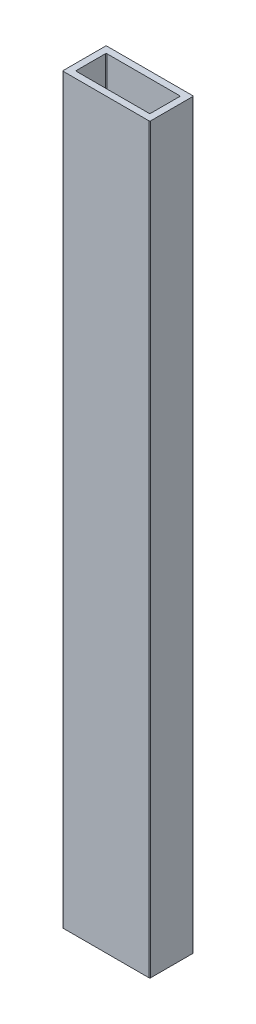
ISO-10303-21;
HEADER;
FILE_DESCRIPTION(('STEP AP214'),'2;1');
FILE_NAME('part.step','',(''),(''),'','','');
FILE_SCHEMA(('AUTOMOTIVE_DESIGN { 1 0 10303 214 1 1 1 1 }'));
ENDSEC;
DATA;
#1=APPLICATION_CONTEXT('core data for automotive mechanical design processes');
#2=APPLICATION_PROTOCOL_DEFINITION('international standard','automotive_design',2000,#1);
#3=PRODUCT_CONTEXT('',#1,'mechanical');
#4=PRODUCT('Part','Part','',(#3));
#5=PRODUCT_RELATED_PRODUCT_CATEGORY('part','',(#4));
#6=PRODUCT_DEFINITION_FORMATION('','',#4);
#7=PRODUCT_DEFINITION_CONTEXT('part definition',#1,'design');
#8=PRODUCT_DEFINITION('design','',#6,#7);
#9=PRODUCT_DEFINITION_SHAPE('','',#8);
#10=(LENGTH_UNIT() NAMED_UNIT(*) SI_UNIT(.MILLI.,.METRE.));
#11=(NAMED_UNIT(*) PLANE_ANGLE_UNIT() SI_UNIT($,.RADIAN.));
#12=(NAMED_UNIT(*) SI_UNIT($,.STERADIAN.) SOLID_ANGLE_UNIT());
#13=UNCERTAINTY_MEASURE_WITH_UNIT(LENGTH_MEASURE(1.E-05),#10,'distance_accuracy_value','');
#14=(GEOMETRIC_REPRESENTATION_CONTEXT(3) GLOBAL_UNCERTAINTY_ASSIGNED_CONTEXT((#13)) GLOBAL_UNIT_ASSIGNED_CONTEXT((#10,
#11,#12)) REPRESENTATION_CONTEXT('',''));
#15=CARTESIAN_POINT('',(0.,0.,0.));
#16=DIRECTION('',(0.,0.,1.));
#17=DIRECTION('',(1.,0.,0.));
#18=AXIS2_PLACEMENT_3D('',#15,#16,#17);
#19=CARTESIAN_POINT('',(0.,170.,0.));
#20=DIRECTION('',(0.,-1.,0.));
#21=DIRECTION('',(0.,0.,-1.));
#22=AXIS2_PLACEMENT_3D('',#19,#20,#21);
#23=PLANE('',#22);
#24=DIRECTION('',(0.,0.,-1.));
#25=VECTOR('',#24,1.);
#26=CARTESIAN_POINT('',(10.,170.,-5.));
#27=LINE('',#26,#25);
#28=CARTESIAN_POINT('',(10.,170.,4.8));
#29=VERTEX_POINT('',#28);
#30=CARTESIAN_POINT('',(10.,170.,-4.8));
#31=VERTEX_POINT('',#30);
#32=EDGE_CURVE('E278',#29,#31,#27,.T.);
#33=ORIENTED_EDGE('',*,*,#32,.T.);
#34=CARTESIAN_POINT('',(9.8,170.,-4.8));
#35=DIRECTION('',(0.,-1.,0.));
#36=DIRECTION('',(0.,0.,-1.));
#37=AXIS2_PLACEMENT_3D('',#34,#35,#36);
#38=CIRCLE('',#37,0.2);
#39=CARTESIAN_POINT('',(9.8,170.,-5.));
#40=VERTEX_POINT('',#39);
#41=EDGE_CURVE('E199',#31,#40,#38,.F.);
#42=ORIENTED_EDGE('',*,*,#41,.T.);
#43=DIRECTION('',(-1.,0.,0.));
#44=VECTOR('',#43,1.);
#45=CARTESIAN_POINT('',(10.,170.,-5.));
#46=LINE('',#45,#44);
#47=CARTESIAN_POINT('',(-9.8,170.,-5.));
#48=VERTEX_POINT('',#47);
#49=EDGE_CURVE('E168',#40,#48,#46,.T.);
#50=ORIENTED_EDGE('',*,*,#49,.T.);
#51=CARTESIAN_POINT('',(-9.8,170.,-4.8));
#52=DIRECTION('',(0.,-1.,0.));
#53=DIRECTION('',(0.,0.,-1.));
#54=AXIS2_PLACEMENT_3D('',#51,#52,#53);
#55=CIRCLE('',#54,0.2);
#56=CARTESIAN_POINT('',(-10.,170.,-4.8));
#57=VERTEX_POINT('',#56);
#58=EDGE_CURVE('E197',#48,#57,#55,.F.);
#59=ORIENTED_EDGE('',*,*,#58,.T.);
#60=DIRECTION('',(0.,0.,1.));
#61=VECTOR('',#60,1.);
#62=CARTESIAN_POINT('',(-10.,170.,-5.));
#63=LINE('',#62,#61);
#64=CARTESIAN_POINT('',(-10.,170.,4.8));
#65=VERTEX_POINT('',#64);
#66=EDGE_CURVE('E175',#57,#65,#63,.T.);
#67=ORIENTED_EDGE('',*,*,#66,.T.);
#68=CARTESIAN_POINT('',(-9.8,170.,4.8));
#69=DIRECTION('',(0.,-1.,0.));
#70=DIRECTION('',(0.,0.,-1.));
#71=AXIS2_PLACEMENT_3D('',#68,#69,#70);
#72=CIRCLE('',#71,0.2);
#73=CARTESIAN_POINT('',(-9.8,170.,5.));
#74=VERTEX_POINT('',#73);
#75=EDGE_CURVE('E193',#65,#74,#72,.F.);
#76=ORIENTED_EDGE('',*,*,#75,.T.);
#77=DIRECTION('',(1.,0.,0.));
#78=VECTOR('',#77,1.);
#79=CARTESIAN_POINT('',(10.,170.,5.));
#80=LINE('',#79,#78);
#81=CARTESIAN_POINT('',(9.8,170.,5.));
#82=VERTEX_POINT('',#81);
#83=EDGE_CURVE('E179',#74,#82,#80,.T.);
#84=ORIENTED_EDGE('',*,*,#83,.T.);
#85=CARTESIAN_POINT('',(9.8,170.,4.8));
#86=DIRECTION('',(0.,-1.,0.));
#87=DIRECTION('',(0.,0.,-1.));
#88=AXIS2_PLACEMENT_3D('',#85,#86,#87);
#89=CIRCLE('',#88,0.2);
#90=EDGE_CURVE('E195',#82,#29,#89,.F.);
#91=ORIENTED_EDGE('',*,*,#90,.T.);
#92=EDGE_LOOP('',(#33,#42,#50,#59,#67,#76,#84,#91));
#93=FACE_BOUND('',#92,.T.);
#94=DIRECTION('',(0.,0.,-1.));
#95=VECTOR('',#94,1.);
#96=CARTESIAN_POINT('',(8.5,170.,-3.5));
#97=LINE('',#96,#95);
#98=CARTESIAN_POINT('',(8.5,170.,3.3));
#99=VERTEX_POINT('',#98);
#100=CARTESIAN_POINT('',(8.5,170.,-3.3));
#101=VERTEX_POINT('',#100);
#102=EDGE_CURVE('E260',#99,#101,#97,.T.);
#103=ORIENTED_EDGE('',*,*,#102,.F.);
#104=CARTESIAN_POINT('',(8.3,170.,3.3));
#105=DIRECTION('',(0.,-1.,0.));
#106=DIRECTION('',(0.,0.,-1.));
#107=AXIS2_PLACEMENT_3D('',#104,#105,#106);
#108=CIRCLE('',#107,0.2);
#109=CARTESIAN_POINT('',(8.3,170.,3.5));
#110=VERTEX_POINT('',#109);
#111=EDGE_CURVE('E236',#99,#110,#108,.T.);
#112=ORIENTED_EDGE('',*,*,#111,.T.);
#113=DIRECTION('',(1.,0.,0.));
#114=VECTOR('',#113,1.);
#115=CARTESIAN_POINT('',(8.5,170.,3.5));
#116=LINE('',#115,#114);
#117=CARTESIAN_POINT('',(-8.3,170.,3.5));
#118=VERTEX_POINT('',#117);
#119=EDGE_CURVE('E262',#118,#110,#116,.T.);
#120=ORIENTED_EDGE('',*,*,#119,.F.);
#121=CARTESIAN_POINT('',(-8.3,170.,3.3));
#122=DIRECTION('',(0.,-1.,0.));
#123=DIRECTION('',(0.,0.,-1.));
#124=AXIS2_PLACEMENT_3D('',#121,#122,#123);
#125=CIRCLE('',#124,0.2);
#126=CARTESIAN_POINT('',(-8.5,170.,3.3));
#127=VERTEX_POINT('',#126);
#128=EDGE_CURVE('E240',#118,#127,#125,.T.);
#129=ORIENTED_EDGE('',*,*,#128,.T.);
#130=DIRECTION('',(0.,0.,1.));
#131=VECTOR('',#130,1.);
#132=CARTESIAN_POINT('',(-8.5,170.,-3.5));
#133=LINE('',#132,#131);
#134=CARTESIAN_POINT('',(-8.5,170.,-3.3));
#135=VERTEX_POINT('',#134);
#136=EDGE_CURVE('E259',#135,#127,#133,.T.);
#137=ORIENTED_EDGE('',*,*,#136,.F.);
#138=CARTESIAN_POINT('',(-8.3,170.,-3.3));
#139=DIRECTION('',(0.,-1.,0.));
#140=DIRECTION('',(0.,0.,-1.));
#141=AXIS2_PLACEMENT_3D('',#138,#139,#140);
#142=CIRCLE('',#141,0.2);
#143=CARTESIAN_POINT('',(-8.3,170.,-3.5));
#144=VERTEX_POINT('',#143);
#145=EDGE_CURVE('E11',#135,#144,#142,.T.);
#146=ORIENTED_EDGE('',*,*,#145,.T.);
#147=DIRECTION('',(-1.,0.,0.));
#148=VECTOR('',#147,1.);
#149=CARTESIAN_POINT('',(8.5,170.,-3.5));
#150=LINE('',#149,#148);
#151=CARTESIAN_POINT('',(8.3,170.,-3.5));
#152=VERTEX_POINT('',#151);
#153=EDGE_CURVE('E257',#152,#144,#150,.T.);
#154=ORIENTED_EDGE('',*,*,#153,.F.);
#155=CARTESIAN_POINT('',(8.3,170.,-3.3));
#156=DIRECTION('',(0.,-1.,0.));
#157=DIRECTION('',(0.,0.,-1.));
#158=AXIS2_PLACEMENT_3D('',#155,#156,#157);
#159=CIRCLE('',#158,0.2);
#160=EDGE_CURVE('E232',#152,#101,#159,.T.);
#161=ORIENTED_EDGE('',*,*,#160,.T.);
#162=EDGE_LOOP('',(#103,#112,#120,#129,#137,#146,#154,#161));
#163=FACE_BOUND('',#162,.T.);
#164=ADVANCED_FACE('F35',(#93,#163),#23,.F.);
#165=CARTESIAN_POINT('',(0.,0.,0.));
#166=DIRECTION('',(0.,-1.,0.));
#167=DIRECTION('',(0.,0.,-1.));
#168=AXIS2_PLACEMENT_3D('',#165,#166,#167);
#169=PLANE('',#168);
#170=DIRECTION('',(-1.,0.,0.));
#171=VECTOR('',#170,1.);
#172=CARTESIAN_POINT('',(10.,0.,-5.));
#173=LINE('',#172,#171);
#174=CARTESIAN_POINT('',(9.8,0.,-5.));
#175=VERTEX_POINT('',#174);
#176=CARTESIAN_POINT('',(-9.8,0.,-5.));
#177=VERTEX_POINT('',#176);
#178=EDGE_CURVE('E165',#175,#177,#173,.T.);
#179=ORIENTED_EDGE('',*,*,#178,.F.);
#180=CARTESIAN_POINT('',(9.8,0.,-4.8));
#181=DIRECTION('',(0.,-1.,0.));
#182=DIRECTION('',(0.,0.,-1.));
#183=AXIS2_PLACEMENT_3D('',#180,#181,#182);
#184=CIRCLE('',#183,0.2);
#185=CARTESIAN_POINT('',(10.,0.,-4.8));
#186=VERTEX_POINT('',#185);
#187=EDGE_CURVE('E148',#175,#186,#184,.T.);
#188=ORIENTED_EDGE('',*,*,#187,.T.);
#189=DIRECTION('',(0.,0.,-1.));
#190=VECTOR('',#189,1.);
#191=CARTESIAN_POINT('',(10.,0.,-5.));
#192=LINE('',#191,#190);
#193=CARTESIAN_POINT('',(10.,0.,4.8));
#194=VERTEX_POINT('',#193);
#195=EDGE_CURVE('E176',#194,#186,#192,.T.);
#196=ORIENTED_EDGE('',*,*,#195,.F.);
#197=CARTESIAN_POINT('',(9.8,0.,4.8));
#198=DIRECTION('',(0.,-1.,0.));
#199=DIRECTION('',(0.,0.,-1.));
#200=AXIS2_PLACEMENT_3D('',#197,#198,#199);
#201=CIRCLE('',#200,0.2);
#202=CARTESIAN_POINT('',(9.8,0.,5.));
#203=VERTEX_POINT('',#202);
#204=EDGE_CURVE('E187',#194,#203,#201,.T.);
#205=ORIENTED_EDGE('',*,*,#204,.T.);
#206=DIRECTION('',(1.,0.,0.));
#207=VECTOR('',#206,1.);
#208=CARTESIAN_POINT('',(10.,0.,5.));
#209=LINE('',#208,#207);
#210=CARTESIAN_POINT('',(-9.8,0.,5.));
#211=VERTEX_POINT('',#210);
#212=EDGE_CURVE('E181',#211,#203,#209,.T.);
#213=ORIENTED_EDGE('',*,*,#212,.F.);
#214=CARTESIAN_POINT('',(-9.8,0.,4.8));
#215=DIRECTION('',(0.,-1.,0.));
#216=DIRECTION('',(0.,0.,-1.));
#217=AXIS2_PLACEMENT_3D('',#214,#215,#216);
#218=CIRCLE('',#217,0.2);
#219=CARTESIAN_POINT('',(-10.,0.,4.8));
#220=VERTEX_POINT('',#219);
#221=EDGE_CURVE('E169',#211,#220,#218,.T.);
#222=ORIENTED_EDGE('',*,*,#221,.T.);
#223=DIRECTION('',(0.,0.,1.));
#224=VECTOR('',#223,1.);
#225=CARTESIAN_POINT('',(-10.,0.,-5.));
#226=LINE('',#225,#224);
#227=CARTESIAN_POINT('',(-10.,0.,-4.8));
#228=VERTEX_POINT('',#227);
#229=EDGE_CURVE('E269',#228,#220,#226,.T.);
#230=ORIENTED_EDGE('',*,*,#229,.F.);
#231=CARTESIAN_POINT('',(-9.8,0.,-4.8));
#232=DIRECTION('',(0.,-1.,0.));
#233=DIRECTION('',(0.,0.,-1.));
#234=AXIS2_PLACEMENT_3D('',#231,#232,#233);
#235=CIRCLE('',#234,0.2);
#236=EDGE_CURVE('E159',#228,#177,#235,.T.);
#237=ORIENTED_EDGE('',*,*,#236,.T.);
#238=EDGE_LOOP('',(#179,#188,#196,#205,#213,#222,#230,#237));
#239=FACE_BOUND('',#238,.T.);
#240=DIRECTION('',(0.,0.,1.));
#241=VECTOR('',#240,1.);
#242=CARTESIAN_POINT('',(-8.5,0.,-3.5));
#243=LINE('',#242,#241);
#244=CARTESIAN_POINT('',(-8.5,0.,-3.3));
#245=VERTEX_POINT('',#244);
#246=CARTESIAN_POINT('',(-8.5,0.,3.3));
#247=VERTEX_POINT('',#246);
#248=EDGE_CURVE('E244',#245,#247,#243,.T.);
#249=ORIENTED_EDGE('',*,*,#248,.T.);
#250=CARTESIAN_POINT('',(-8.3,0.,3.3));
#251=DIRECTION('',(0.,-1.,0.));
#252=DIRECTION('',(0.,0.,-1.));
#253=AXIS2_PLACEMENT_3D('',#250,#251,#252);
#254=CIRCLE('',#253,0.2);
#255=CARTESIAN_POINT('',(-8.3,0.,3.5));
#256=VERTEX_POINT('',#255);
#257=EDGE_CURVE('E238',#247,#256,#254,.F.);
#258=ORIENTED_EDGE('',*,*,#257,.T.);
#259=DIRECTION('',(1.,0.,0.));
#260=VECTOR('',#259,1.);
#261=CARTESIAN_POINT('',(8.5,0.,3.5));
#262=LINE('',#261,#260);
#263=CARTESIAN_POINT('',(8.3,0.,3.5));
#264=VERTEX_POINT('',#263);
#265=EDGE_CURVE('E253',#256,#264,#262,.T.);
#266=ORIENTED_EDGE('',*,*,#265,.T.);
#267=CARTESIAN_POINT('',(8.3,0.,3.3));
#268=DIRECTION('',(0.,-1.,0.));
#269=DIRECTION('',(0.,0.,-1.));
#270=AXIS2_PLACEMENT_3D('',#267,#268,#269);
#271=CIRCLE('',#270,0.2);
#272=CARTESIAN_POINT('',(8.5,0.,3.3));
#273=VERTEX_POINT('',#272);
#274=EDGE_CURVE('E234',#264,#273,#271,.F.);
#275=ORIENTED_EDGE('',*,*,#274,.T.);
#276=DIRECTION('',(0.,0.,-1.));
#277=VECTOR('',#276,1.);
#278=CARTESIAN_POINT('',(8.5,0.,-3.5));
#279=LINE('',#278,#277);
#280=CARTESIAN_POINT('',(8.5,0.,-3.3));
#281=VERTEX_POINT('',#280);
#282=EDGE_CURVE('E270',#273,#281,#279,.T.);
#283=ORIENTED_EDGE('',*,*,#282,.T.);
#284=CARTESIAN_POINT('',(8.3,0.,-3.3));
#285=DIRECTION('',(0.,-1.,0.));
#286=DIRECTION('',(0.,0.,-1.));
#287=AXIS2_PLACEMENT_3D('',#284,#285,#286);
#288=CIRCLE('',#287,0.2);
#289=CARTESIAN_POINT('',(8.3,0.,-3.5));
#290=VERTEX_POINT('',#289);
#291=EDGE_CURVE('E230',#281,#290,#288,.F.);
#292=ORIENTED_EDGE('',*,*,#291,.T.);
#293=DIRECTION('',(-1.,0.,0.));
#294=VECTOR('',#293,1.);
#295=CARTESIAN_POINT('',(8.5,0.,-3.5));
#296=LINE('',#295,#294);
#297=CARTESIAN_POINT('',(-8.3,0.,-3.5));
#298=VERTEX_POINT('',#297);
#299=EDGE_CURVE('E245',#290,#298,#296,.T.);
#300=ORIENTED_EDGE('',*,*,#299,.T.);
#301=CARTESIAN_POINT('',(-8.3,0.,-3.3));
#302=DIRECTION('',(0.,-1.,0.));
#303=DIRECTION('',(0.,0.,-1.));
#304=AXIS2_PLACEMENT_3D('',#301,#302,#303);
#305=CIRCLE('',#304,0.2);
#306=EDGE_CURVE('E43',#298,#245,#305,.F.);
#307=ORIENTED_EDGE('',*,*,#306,.T.);
#308=EDGE_LOOP('',(#249,#258,#266,#275,#283,#292,#300,#307));
#309=FACE_BOUND('',#308,.T.);
#310=ADVANCED_FACE('F172',(#239,#309),#169,.T.);
#311=CARTESIAN_POINT('',(-10.,170.,-5.));
#312=DIRECTION('',(1.,0.,0.));
#313=DIRECTION('',(0.,0.,-1.));
#314=AXIS2_PLACEMENT_3D('',#311,#312,#313);
#315=PLANE('',#314);
#316=ORIENTED_EDGE('',*,*,#66,.F.);
#317=DIRECTION('',(0.,-1.,0.));
#318=VECTOR('',#317,1.);
#319=CARTESIAN_POINT('',(-10.,170.,-4.8));
#320=LINE('',#319,#318);
#321=EDGE_CURVE('E222',#57,#228,#320,.T.);
#322=ORIENTED_EDGE('',*,*,#321,.T.);
#323=ORIENTED_EDGE('',*,*,#229,.T.);
#324=DIRECTION('',(0.,-1.,0.));
#325=VECTOR('',#324,1.);
#326=CARTESIAN_POINT('',(-10.,170.,4.8));
#327=LINE('',#326,#325);
#328=EDGE_CURVE('E220',#220,#65,#327,.F.);
#329=ORIENTED_EDGE('',*,*,#328,.T.);
#330=EDGE_LOOP('',(#316,#322,#323,#329));
#331=FACE_BOUND('',#330,.T.);
#332=ADVANCED_FACE('F306',(#331),#315,.F.);
#333=CARTESIAN_POINT('',(10.,170.,5.));
#334=DIRECTION('',(0.,0.,-1.));
#335=DIRECTION('',(-1.,0.,0.));
#336=AXIS2_PLACEMENT_3D('',#333,#334,#335);
#337=PLANE('',#336);
#338=ORIENTED_EDGE('',*,*,#212,.T.);
#339=DIRECTION('',(0.,-1.,0.));
#340=VECTOR('',#339,1.);
#341=CARTESIAN_POINT('',(9.8,170.,5.));
#342=LINE('',#341,#340);
#343=EDGE_CURVE('E228',#203,#82,#342,.F.);
#344=ORIENTED_EDGE('',*,*,#343,.T.);
#345=ORIENTED_EDGE('',*,*,#83,.F.);
#346=DIRECTION('',(0.,-1.,0.));
#347=VECTOR('',#346,1.);
#348=CARTESIAN_POINT('',(-9.8,170.,5.));
#349=LINE('',#348,#347);
#350=EDGE_CURVE('E225',#74,#211,#349,.T.);
#351=ORIENTED_EDGE('',*,*,#350,.T.);
#352=EDGE_LOOP('',(#338,#344,#345,#351));
#353=FACE_BOUND('',#352,.T.);
#354=ADVANCED_FACE('F287',(#353),#337,.F.);
#355=CARTESIAN_POINT('',(10.,170.,-5.));
#356=DIRECTION('',(-1.,0.,0.));
#357=DIRECTION('',(0.,0.,1.));
#358=AXIS2_PLACEMENT_3D('',#355,#356,#357);
#359=PLANE('',#358);
#360=ORIENTED_EDGE('',*,*,#195,.T.);
#361=DIRECTION('',(0.,-1.,0.));
#362=VECTOR('',#361,1.);
#363=CARTESIAN_POINT('',(10.,170.,-4.8));
#364=LINE('',#363,#362);
#365=EDGE_CURVE('E153',#186,#31,#364,.F.);
#366=ORIENTED_EDGE('',*,*,#365,.T.);
#367=ORIENTED_EDGE('',*,*,#32,.F.);
#368=DIRECTION('',(0.,-1.,0.));
#369=VECTOR('',#368,1.);
#370=CARTESIAN_POINT('',(10.,170.,4.8));
#371=LINE('',#370,#369);
#372=EDGE_CURVE('E158',#29,#194,#371,.T.);
#373=ORIENTED_EDGE('',*,*,#372,.T.);
#374=EDGE_LOOP('',(#360,#366,#367,#373));
#375=FACE_BOUND('',#374,.T.);
#376=ADVANCED_FACE('F297',(#375),#359,.F.);
#377=CARTESIAN_POINT('',(10.,170.,-5.));
#378=DIRECTION('',(0.,0.,1.));
#379=DIRECTION('',(1.,0.,0.));
#380=AXIS2_PLACEMENT_3D('',#377,#378,#379);
#381=PLANE('',#380);
#382=ORIENTED_EDGE('',*,*,#49,.F.);
#383=DIRECTION('',(0.,-1.,0.));
#384=VECTOR('',#383,1.);
#385=CARTESIAN_POINT('',(9.8,170.,-5.));
#386=LINE('',#385,#384);
#387=EDGE_CURVE('E152',#40,#175,#386,.T.);
#388=ORIENTED_EDGE('',*,*,#387,.T.);
#389=ORIENTED_EDGE('',*,*,#178,.T.);
#390=DIRECTION('',(0.,-1.,0.));
#391=VECTOR('',#390,1.);
#392=CARTESIAN_POINT('',(-9.8,170.,-5.));
#393=LINE('',#392,#391);
#394=EDGE_CURVE('E170',#177,#48,#393,.F.);
#395=ORIENTED_EDGE('',*,*,#394,.T.);
#396=EDGE_LOOP('',(#382,#388,#389,#395));
#397=FACE_BOUND('',#396,.T.);
#398=ADVANCED_FACE('F164',(#397),#381,.F.);
#399=CARTESIAN_POINT('',(8.5,170.,-3.5));
#400=DIRECTION('',(-1.,0.,0.));
#401=DIRECTION('',(0.,0.,1.));
#402=AXIS2_PLACEMENT_3D('',#399,#400,#401);
#403=PLANE('',#402);
#404=ORIENTED_EDGE('',*,*,#102,.T.);
#405=DIRECTION('',(0.,-1.,0.));
#406=VECTOR('',#405,1.);
#407=CARTESIAN_POINT('',(8.5,0.,-3.3));
#408=LINE('',#407,#406);
#409=EDGE_CURVE('E203',#101,#281,#408,.T.);
#410=ORIENTED_EDGE('',*,*,#409,.T.);
#411=ORIENTED_EDGE('',*,*,#282,.F.);
#412=DIRECTION('',(0.,-1.,0.));
#413=VECTOR('',#412,1.);
#414=CARTESIAN_POINT('',(8.5,170.,3.3));
#415=LINE('',#414,#413);
#416=EDGE_CURVE('E201',#273,#99,#415,.F.);
#417=ORIENTED_EDGE('',*,*,#416,.T.);
#418=EDGE_LOOP('',(#404,#410,#411,#417));
#419=FACE_BOUND('',#418,.T.);
#420=ADVANCED_FACE('F304',(#419),#403,.T.);
#421=CARTESIAN_POINT('',(8.5,170.,-3.5));
#422=DIRECTION('',(0.,0.,1.));
#423=DIRECTION('',(1.,0.,0.));
#424=AXIS2_PLACEMENT_3D('',#421,#422,#423);
#425=PLANE('',#424);
#426=ORIENTED_EDGE('',*,*,#299,.F.);
#427=DIRECTION('',(0.,-1.,0.));
#428=VECTOR('',#427,1.);
#429=CARTESIAN_POINT('',(8.3,170.,-3.5));
#430=LINE('',#429,#428);
#431=EDGE_CURVE('E55',#290,#152,#430,.F.);
#432=ORIENTED_EDGE('',*,*,#431,.T.);
#433=ORIENTED_EDGE('',*,*,#153,.T.);
#434=DIRECTION('',(0.,-1.,0.));
#435=VECTOR('',#434,1.);
#436=CARTESIAN_POINT('',(-8.3,0.,-3.5));
#437=LINE('',#436,#435);
#438=EDGE_CURVE('E206',#144,#298,#437,.T.);
#439=ORIENTED_EDGE('',*,*,#438,.T.);
#440=EDGE_LOOP('',(#426,#432,#433,#439));
#441=FACE_BOUND('',#440,.T.);
#442=ADVANCED_FACE('F256',(#441),#425,.T.);
#443=CARTESIAN_POINT('',(-8.5,170.,-3.5));
#444=DIRECTION('',(1.,0.,0.));
#445=DIRECTION('',(0.,0.,-1.));
#446=AXIS2_PLACEMENT_3D('',#443,#444,#445);
#447=PLANE('',#446);
#448=ORIENTED_EDGE('',*,*,#136,.T.);
#449=DIRECTION('',(0.,-1.,0.));
#450=VECTOR('',#449,1.);
#451=CARTESIAN_POINT('',(-8.5,0.,3.3));
#452=LINE('',#451,#450);
#453=EDGE_CURVE('E217',#127,#247,#452,.T.);
#454=ORIENTED_EDGE('',*,*,#453,.T.);
#455=ORIENTED_EDGE('',*,*,#248,.F.);
#456=DIRECTION('',(0.,-1.,0.));
#457=VECTOR('',#456,1.);
#458=CARTESIAN_POINT('',(-8.5,170.,-3.3));
#459=LINE('',#458,#457);
#460=EDGE_CURVE('E215',#245,#135,#459,.F.);
#461=ORIENTED_EDGE('',*,*,#460,.T.);
#462=EDGE_LOOP('',(#448,#454,#455,#461));
#463=FACE_BOUND('',#462,.T.);
#464=ADVANCED_FACE('F251',(#463),#447,.T.);
#465=CARTESIAN_POINT('',(8.5,170.,3.5));
#466=DIRECTION('',(0.,0.,-1.));
#467=DIRECTION('',(-1.,0.,0.));
#468=AXIS2_PLACEMENT_3D('',#465,#466,#467);
#469=PLANE('',#468);
#470=ORIENTED_EDGE('',*,*,#119,.T.);
#471=DIRECTION('',(0.,-1.,0.));
#472=VECTOR('',#471,1.);
#473=CARTESIAN_POINT('',(8.3,0.,3.5));
#474=LINE('',#473,#472);
#475=EDGE_CURVE('E212',#110,#264,#474,.T.);
#476=ORIENTED_EDGE('',*,*,#475,.T.);
#477=ORIENTED_EDGE('',*,*,#265,.F.);
#478=DIRECTION('',(0.,-1.,0.));
#479=VECTOR('',#478,1.);
#480=CARTESIAN_POINT('',(-8.3,170.,3.5));
#481=LINE('',#480,#479);
#482=EDGE_CURVE('E210',#256,#118,#481,.F.);
#483=ORIENTED_EDGE('',*,*,#482,.T.);
#484=EDGE_LOOP('',(#470,#476,#477,#483));
#485=FACE_BOUND('',#484,.T.);
#486=ADVANCED_FACE('F322',(#485),#469,.T.);
#487=CARTESIAN_POINT('',(9.8,170.,-4.8));
#488=DIRECTION('',(0.,-1.,0.));
#489=DIRECTION('',(0.,0.,-1.));
#490=AXIS2_PLACEMENT_3D('',#487,#488,#489);
#491=CYLINDRICAL_SURFACE('',#490,0.2);
#492=ORIENTED_EDGE('',*,*,#41,.F.);
#493=ORIENTED_EDGE('',*,*,#365,.F.);
#494=ORIENTED_EDGE('',*,*,#187,.F.);
#495=ORIENTED_EDGE('',*,*,#387,.F.);
#496=EDGE_LOOP('',(#492,#493,#494,#495));
#497=FACE_BOUND('',#496,.T.);
#498=ADVANCED_FACE('F151',(#497),#491,.T.);
#499=CARTESIAN_POINT('',(8.3,170.,-3.3));
#500=DIRECTION('',(0.,1.,0.));
#501=DIRECTION('',(0.,0.,1.));
#502=AXIS2_PLACEMENT_3D('',#499,#500,#501);
#503=CYLINDRICAL_SURFACE('',#502,0.2);
#504=ORIENTED_EDGE('',*,*,#160,.F.);
#505=ORIENTED_EDGE('',*,*,#431,.F.);
#506=ORIENTED_EDGE('',*,*,#291,.F.);
#507=ORIENTED_EDGE('',*,*,#409,.F.);
#508=EDGE_LOOP('',(#504,#505,#506,#507));
#509=FACE_BOUND('',#508,.T.);
#510=ADVANCED_FACE('F328',(#509),#503,.F.);
#511=CARTESIAN_POINT('',(8.3,170.,3.3));
#512=DIRECTION('',(0.,1.,0.));
#513=DIRECTION('',(0.,0.,1.));
#514=AXIS2_PLACEMENT_3D('',#511,#512,#513);
#515=CYLINDRICAL_SURFACE('',#514,0.2);
#516=ORIENTED_EDGE('',*,*,#111,.F.);
#517=ORIENTED_EDGE('',*,*,#416,.F.);
#518=ORIENTED_EDGE('',*,*,#274,.F.);
#519=ORIENTED_EDGE('',*,*,#475,.F.);
#520=EDGE_LOOP('',(#516,#517,#518,#519));
#521=FACE_BOUND('',#520,.T.);
#522=ADVANCED_FACE('F337',(#521),#515,.F.);
#523=CARTESIAN_POINT('',(-8.3,170.,3.3));
#524=DIRECTION('',(0.,1.,0.));
#525=DIRECTION('',(0.,0.,1.));
#526=AXIS2_PLACEMENT_3D('',#523,#524,#525);
#527=CYLINDRICAL_SURFACE('',#526,0.2);
#528=ORIENTED_EDGE('',*,*,#128,.F.);
#529=ORIENTED_EDGE('',*,*,#482,.F.);
#530=ORIENTED_EDGE('',*,*,#257,.F.);
#531=ORIENTED_EDGE('',*,*,#453,.F.);
#532=EDGE_LOOP('',(#528,#529,#530,#531));
#533=FACE_BOUND('',#532,.T.);
#534=ADVANCED_FACE('F348',(#533),#527,.F.);
#535=CARTESIAN_POINT('',(-8.3,170.,-3.3));
#536=DIRECTION('',(0.,1.,0.));
#537=DIRECTION('',(0.,0.,1.));
#538=AXIS2_PLACEMENT_3D('',#535,#536,#537);
#539=CYLINDRICAL_SURFACE('',#538,0.2);
#540=ORIENTED_EDGE('',*,*,#145,.F.);
#541=ORIENTED_EDGE('',*,*,#460,.F.);
#542=ORIENTED_EDGE('',*,*,#306,.F.);
#543=ORIENTED_EDGE('',*,*,#438,.F.);
#544=EDGE_LOOP('',(#540,#541,#542,#543));
#545=FACE_BOUND('',#544,.T.);
#546=ADVANCED_FACE('F255',(#545),#539,.F.);
#547=CARTESIAN_POINT('',(-9.8,170.,-4.8));
#548=DIRECTION('',(0.,-1.,0.));
#549=DIRECTION('',(0.,0.,-1.));
#550=AXIS2_PLACEMENT_3D('',#547,#548,#549);
#551=CYLINDRICAL_SURFACE('',#550,0.2);
#552=ORIENTED_EDGE('',*,*,#58,.F.);
#553=ORIENTED_EDGE('',*,*,#394,.F.);
#554=ORIENTED_EDGE('',*,*,#236,.F.);
#555=ORIENTED_EDGE('',*,*,#321,.F.);
#556=EDGE_LOOP('',(#552,#553,#554,#555));
#557=FACE_BOUND('',#556,.T.);
#558=ADVANCED_FACE('F357',(#557),#551,.T.);
#559=CARTESIAN_POINT('',(9.8,170.,4.8));
#560=DIRECTION('',(0.,-1.,0.));
#561=DIRECTION('',(0.,0.,-1.));
#562=AXIS2_PLACEMENT_3D('',#559,#560,#561);
#563=CYLINDRICAL_SURFACE('',#562,0.2);
#564=ORIENTED_EDGE('',*,*,#90,.F.);
#565=ORIENTED_EDGE('',*,*,#343,.F.);
#566=ORIENTED_EDGE('',*,*,#204,.F.);
#567=ORIENTED_EDGE('',*,*,#372,.F.);
#568=EDGE_LOOP('',(#564,#565,#566,#567));
#569=FACE_BOUND('',#568,.T.);
#570=ADVANCED_FACE('F292',(#569),#563,.T.);
#571=CARTESIAN_POINT('',(-9.8,170.,4.8));
#572=DIRECTION('',(0.,-1.,0.));
#573=DIRECTION('',(0.,0.,-1.));
#574=AXIS2_PLACEMENT_3D('',#571,#572,#573);
#575=CYLINDRICAL_SURFACE('',#574,0.2);
#576=ORIENTED_EDGE('',*,*,#75,.F.);
#577=ORIENTED_EDGE('',*,*,#328,.F.);
#578=ORIENTED_EDGE('',*,*,#221,.F.);
#579=ORIENTED_EDGE('',*,*,#350,.F.);
#580=EDGE_LOOP('',(#576,#577,#578,#579));
#581=FACE_BOUND('',#580,.T.);
#582=ADVANCED_FACE('F37',(#581),#575,.T.);
#583=CLOSED_SHELL('',(#164,#310,#332,#354,#376,#398,#420,#442,#464,#486,#498,#510,#522,#534,
#546,#558,#570,#582));
#584=MANIFOLD_SOLID_BREP('B2',#583);
#585=ADVANCED_BREP_SHAPE_REPRESENTATION('',(#18,#584),#14);
#586=SHAPE_DEFINITION_REPRESENTATION(#9,#585);
ENDSEC;
END-ISO-10303-21;
